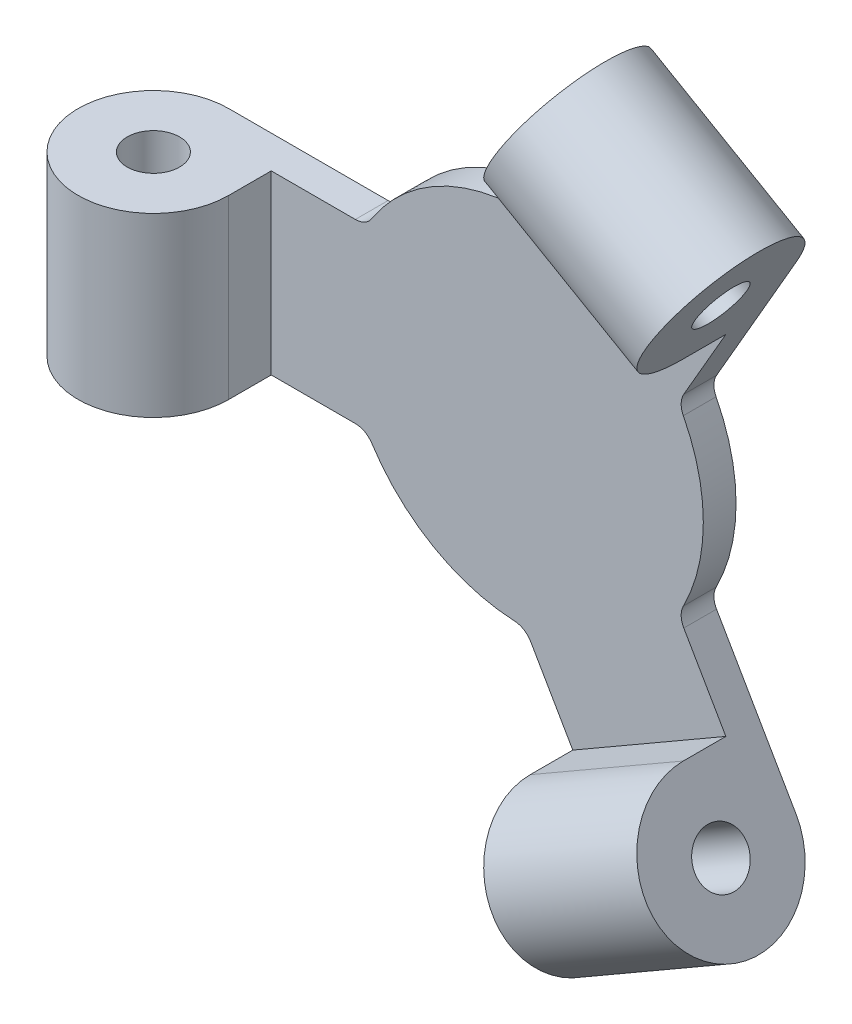
ISO-10303-21;
HEADER;
FILE_DESCRIPTION(('STEP AP214'),'2;1');
FILE_NAME('part.step','',(''),(''),'','','');
FILE_SCHEMA(('AUTOMOTIVE_DESIGN { 1 0 10303 214 1 1 1 1 }'));
ENDSEC;
DATA;
#1=APPLICATION_CONTEXT('core data for automotive mechanical design processes');
#2=APPLICATION_PROTOCOL_DEFINITION('international standard','automotive_design',2000,#1);
#3=PRODUCT_CONTEXT('',#1,'mechanical');
#4=PRODUCT('Part','Part','',(#3));
#5=PRODUCT_RELATED_PRODUCT_CATEGORY('part','',(#4));
#6=PRODUCT_DEFINITION_FORMATION('','',#4);
#7=PRODUCT_DEFINITION_CONTEXT('part definition',#1,'design');
#8=PRODUCT_DEFINITION('design','',#6,#7);
#9=PRODUCT_DEFINITION_SHAPE('','',#8);
#10=(LENGTH_UNIT() NAMED_UNIT(*) SI_UNIT(.MILLI.,.METRE.));
#11=(NAMED_UNIT(*) PLANE_ANGLE_UNIT() SI_UNIT($,.RADIAN.));
#12=(NAMED_UNIT(*) SI_UNIT($,.STERADIAN.) SOLID_ANGLE_UNIT());
#13=UNCERTAINTY_MEASURE_WITH_UNIT(LENGTH_MEASURE(1.E-05),#10,'distance_accuracy_value','');
#14=(GEOMETRIC_REPRESENTATION_CONTEXT(3) GLOBAL_UNCERTAINTY_ASSIGNED_CONTEXT((#13)) GLOBAL_UNIT_ASSIGNED_CONTEXT((#10,
#11,#12)) REPRESENTATION_CONTEXT('',''));
#15=CARTESIAN_POINT('',(0.,0.,0.));
#16=DIRECTION('',(0.,0.,1.));
#17=DIRECTION('',(1.,0.,0.));
#18=AXIS2_PLACEMENT_3D('',#15,#16,#17);
#19=CARTESIAN_POINT('',(7.55865704891,40.0919780457,11.5));
#20=DIRECTION('',(-0.500000000000017,-0.866025403784429,0.));
#21=DIRECTION('',(0.866025403784429,-0.500000000000017,0.));
#22=AXIS2_PLACEMENT_3D('',#19,#20,#21);
#23=PLANE('',#22);
#24=DIRECTION('',(0.,0.,1.));
#25=VECTOR('',#24,1.);
#26=CARTESIAN_POINT('',(7.55865704891,40.0919780457,0.));
#27=LINE('',#26,#25);
#28=CARTESIAN_POINT('',(7.55865704891,40.0919780457,5.));
#29=VERTEX_POINT('',#28);
#30=CARTESIAN_POINT('',(7.55865704891004,40.0919780456995,11.5));
#31=VERTEX_POINT('',#30);
#32=EDGE_CURVE('E203',#29,#31,#27,.T.);
#33=ORIENTED_EDGE('',*,*,#32,.F.);
#34=DIRECTION('',(-0.86602540378444,0.499999999999998,0.));
#35=VECTOR('',#34,1.);
#36=CARTESIAN_POINT('',(30.94134295109,26.5919780457,5.));
#37=LINE('',#36,#35);
#38=CARTESIAN_POINT('',(30.9413429510884,26.5919780457009,5.));
#39=VERTEX_POINT('',#38);
#40=EDGE_CURVE('E208',#39,#29,#37,.T.);
#41=ORIENTED_EDGE('',*,*,#40,.F.);
#42=DIRECTION('',(0.,0.,1.));
#43=VECTOR('',#42,1.);
#44=CARTESIAN_POINT('',(30.9413429510876,26.5919780457014,0.));
#45=LINE('',#44,#43);
#46=CARTESIAN_POINT('',(30.9413429510883,26.5919780456997,11.5));
#47=VERTEX_POINT('',#46);
#48=EDGE_CURVE('E153',#47,#39,#45,.F.);
#49=ORIENTED_EDGE('',*,*,#48,.F.);
#50=DIRECTION('',(0.866025403784429,-0.500000000000017,0.));
#51=VECTOR('',#50,1.);
#52=CARTESIAN_POINT('',(7.55865704890981,40.0919780456991,11.5));
#53=LINE('',#52,#51);
#54=EDGE_CURVE('E145',#31,#47,#53,.T.);
#55=ORIENTED_EDGE('',*,*,#54,.F.);
#56=EDGE_LOOP('',(#33,#41,#49,#55));
#57=FACE_BOUND('',#56,.T.);
#58=ADVANCED_FACE('F16',(#57),#23,.T.);
#59=CARTESIAN_POINT('',(13.30865704891,50.05127018922,11.5));
#60=DIRECTION('',(0.866025403784429,-0.500000000000017,0.));
#61=DIRECTION('',(0.500000000000017,0.866025403784429,0.));
#62=AXIS2_PLACEMENT_3D('',#59,#60,#61);
#63=CYLINDRICAL_SURFACE('',#62,4.);
#64=CARTESIAN_POINT('',(36.6913429510887,36.5512701892201,11.5));
#65=DIRECTION('',(0.866025403784429,-0.500000000000017,0.));
#66=DIRECTION('',(0.500000000000017,0.866025403784429,0.));
#67=AXIS2_PLACEMENT_3D('',#64,#65,#66);
#68=CIRCLE('',#67,4.);
#69=CARTESIAN_POINT('',(38.6913429510887,40.0153718043578,11.5));
#70=VERTEX_POINT('',#69);
#71=EDGE_CURVE('E19',#70,#70,#68,.F.);
#72=ORIENTED_EDGE('',*,*,#71,.F.);
#73=EDGE_LOOP('',(#72));
#74=FACE_BOUND('',#73,.T.);
#75=CARTESIAN_POINT('',(13.308657048911,50.0512701892194,11.5));
#76=DIRECTION('',(0.866025403784429,-0.500000000000017,0.));
#77=DIRECTION('',(0.500000000000017,0.866025403784429,0.));
#78=AXIS2_PLACEMENT_3D('',#75,#76,#77);
#79=CIRCLE('',#78,4.);
#80=CARTESIAN_POINT('',(15.3086570489111,53.5153718043571,11.5));
#81=VERTEX_POINT('',#80);
#82=EDGE_CURVE('E292',#81,#81,#79,.T.);
#83=ORIENTED_EDGE('',*,*,#82,.F.);
#84=EDGE_LOOP('',(#83));
#85=FACE_BOUND('',#84,.T.);
#86=ADVANCED_FACE('F651',(#74,#85),#63,.F.);
#87=CARTESIAN_POINT('',(-38.5,-13.5,11.5));
#88=DIRECTION('',(1.,0.,0.));
#89=DIRECTION('',(0.,0.,-1.));
#90=AXIS2_PLACEMENT_3D('',#87,#88,#89);
#91=PLANE('',#90);
#92=DIRECTION('',(0.,0.,-1.));
#93=VECTOR('',#92,1.);
#94=CARTESIAN_POINT('',(-38.5,-13.5,0.));
#95=LINE('',#94,#93);
#96=CARTESIAN_POINT('',(-38.5,-13.5,5.));
#97=VERTEX_POINT('',#96);
#98=CARTESIAN_POINT('',(-38.5,-13.5,11.5));
#99=VERTEX_POINT('',#98);
#100=EDGE_CURVE('E181',#97,#99,#95,.F.);
#101=ORIENTED_EDGE('',*,*,#100,.F.);
#102=DIRECTION('',(0.,1.,0.));
#103=VECTOR('',#102,1.);
#104=CARTESIAN_POINT('',(-38.5,0.,5.));
#105=LINE('',#104,#103);
#106=CARTESIAN_POINT('',(-38.5,13.5,5.));
#107=VERTEX_POINT('',#106);
#108=EDGE_CURVE('E179',#107,#97,#105,.F.);
#109=ORIENTED_EDGE('',*,*,#108,.F.);
#110=DIRECTION('',(0.,0.,1.));
#111=VECTOR('',#110,1.);
#112=CARTESIAN_POINT('',(-38.5,13.5,0.));
#113=LINE('',#112,#111);
#114=CARTESIAN_POINT('',(-38.5,13.5,11.5));
#115=VERTEX_POINT('',#114);
#116=EDGE_CURVE('E166',#115,#107,#113,.F.);
#117=ORIENTED_EDGE('',*,*,#116,.F.);
#118=DIRECTION('',(0.,1.,0.));
#119=VECTOR('',#118,1.);
#120=CARTESIAN_POINT('',(-38.5,-13.5,11.5));
#121=LINE('',#120,#119);
#122=EDGE_CURVE('E193',#99,#115,#121,.T.);
#123=ORIENTED_EDGE('',*,*,#122,.F.);
#124=EDGE_LOOP('',(#101,#109,#117,#123));
#125=FACE_BOUND('',#124,.T.);
#126=ADVANCED_FACE('F180',(#125),#91,.T.);
#127=CARTESIAN_POINT('',(-50.,-13.5,11.5));
#128=DIRECTION('',(0.,1.,0.));
#129=DIRECTION('',(0.,0.,1.));
#130=AXIS2_PLACEMENT_3D('',#127,#128,#129);
#131=CYLINDRICAL_SURFACE('',#130,4.);
#132=CARTESIAN_POINT('',(-50.,13.5,11.5));
#133=DIRECTION('',(0.,1.,0.));
#134=DIRECTION('',(0.,0.,1.));
#135=AXIS2_PLACEMENT_3D('',#132,#133,#134);
#136=CIRCLE('',#135,4.);
#137=CARTESIAN_POINT('',(-50.,13.5,15.5));
#138=VERTEX_POINT('',#137);
#139=EDGE_CURVE('E190',#138,#138,#136,.F.);
#140=ORIENTED_EDGE('',*,*,#139,.F.);
#141=EDGE_LOOP('',(#140));
#142=FACE_BOUND('',#141,.T.);
#143=CARTESIAN_POINT('',(-50.,-13.5,11.5));
#144=DIRECTION('',(0.,1.,0.));
#145=DIRECTION('',(0.,0.,1.));
#146=AXIS2_PLACEMENT_3D('',#143,#144,#145);
#147=CIRCLE('',#146,4.);
#148=CARTESIAN_POINT('',(-50.,-13.5,15.5));
#149=VERTEX_POINT('',#148);
#150=EDGE_CURVE('E276',#149,#149,#147,.T.);
#151=ORIENTED_EDGE('',*,*,#150,.F.);
#152=EDGE_LOOP('',(#151));
#153=FACE_BOUND('',#152,.T.);
#154=ADVANCED_FACE('F446',(#142,#153),#131,.F.);
#155=CARTESIAN_POINT('',(30.94134295109,-26.5919780457,11.5));
#156=DIRECTION('',(-0.500000000000017,0.866025403784429,0.));
#157=DIRECTION('',(-0.866025403784429,-0.500000000000017,0.));
#158=AXIS2_PLACEMENT_3D('',#155,#156,#157);
#159=PLANE('',#158);
#160=DIRECTION('',(0.,0.,1.));
#161=VECTOR('',#160,1.);
#162=CARTESIAN_POINT('',(30.94134295109,-26.5919780457,0.));
#163=LINE('',#162,#161);
#164=CARTESIAN_POINT('',(30.94134295109,-26.5919780457,5.));
#165=VERTEX_POINT('',#164);
#166=CARTESIAN_POINT('',(30.94134295109,-26.5919780456995,11.5));
#167=VERTEX_POINT('',#166);
#168=EDGE_CURVE('E256',#165,#167,#163,.T.);
#169=ORIENTED_EDGE('',*,*,#168,.F.);
#170=DIRECTION('',(0.86602540378444,0.499999999999998,0.));
#171=VECTOR('',#170,1.);
#172=CARTESIAN_POINT('',(7.55865704891,-40.0919780457,5.));
#173=LINE('',#172,#171);
#174=CARTESIAN_POINT('',(7.55865704890891,-40.0919780457006,5.));
#175=VERTEX_POINT('',#174);
#176=EDGE_CURVE('E184',#175,#165,#173,.T.);
#177=ORIENTED_EDGE('',*,*,#176,.F.);
#178=DIRECTION('',(0.,0.,1.));
#179=VECTOR('',#178,1.);
#180=CARTESIAN_POINT('',(7.55865704890836,-40.0919780457009,0.));
#181=LINE('',#180,#179);
#182=CARTESIAN_POINT('',(7.55865704890914,-40.0919780457004,11.5));
#183=VERTEX_POINT('',#182);
#184=EDGE_CURVE('E328',#183,#175,#181,.F.);
#185=ORIENTED_EDGE('',*,*,#184,.F.);
#186=DIRECTION('',(-0.866025403784429,-0.500000000000017,0.));
#187=VECTOR('',#186,1.);
#188=CARTESIAN_POINT('',(30.9413429510898,-26.5919780456991,11.5));
#189=LINE('',#188,#187);
#190=EDGE_CURVE('E260',#167,#183,#189,.T.);
#191=ORIENTED_EDGE('',*,*,#190,.F.);
#192=EDGE_LOOP('',(#169,#177,#185,#191));
#193=FACE_BOUND('',#192,.T.);
#194=ADVANCED_FACE('F443',(#193),#159,.T.);
#195=CARTESIAN_POINT('',(36.69134295109,-36.55127018922,11.5));
#196=DIRECTION('',(-0.866025403784429,-0.500000000000017,0.));
#197=DIRECTION('',(0.500000000000017,-0.866025403784429,0.));
#198=AXIS2_PLACEMENT_3D('',#195,#196,#197);
#199=CYLINDRICAL_SURFACE('',#198,4.);
#200=CARTESIAN_POINT('',(13.3086570489092,-50.0512701892211,11.5));
#201=DIRECTION('',(-0.866025403784429,-0.500000000000017,0.));
#202=DIRECTION('',(0.500000000000017,-0.866025403784429,0.));
#203=AXIS2_PLACEMENT_3D('',#200,#201,#202);
#204=CIRCLE('',#203,4.);
#205=CARTESIAN_POINT('',(15.3086570489093,-53.5153718043588,11.5));
#206=VERTEX_POINT('',#205);
#207=EDGE_CURVE('E261',#206,#206,#204,.F.);
#208=ORIENTED_EDGE('',*,*,#207,.F.);
#209=EDGE_LOOP('',(#208));
#210=FACE_BOUND('',#209,.T.);
#211=CARTESIAN_POINT('',(36.691342951091,-36.5512701892194,11.5));
#212=DIRECTION('',(-0.866025403784429,-0.500000000000017,0.));
#213=DIRECTION('',(0.500000000000017,-0.866025403784429,0.));
#214=AXIS2_PLACEMENT_3D('',#211,#212,#213);
#215=CIRCLE('',#214,4.);
#216=CARTESIAN_POINT('',(38.6913429510911,-40.0153718043571,11.5));
#217=VERTEX_POINT('',#216);
#218=EDGE_CURVE('E251',#217,#217,#215,.T.);
#219=ORIENTED_EDGE('',*,*,#218,.F.);
#220=EDGE_LOOP('',(#219));
#221=FACE_BOUND('',#220,.T.);
#222=ADVANCED_FACE('F445',(#210,#221),#199,.F.);
#223=CARTESIAN_POINT('',(0.,0.,5.));
#224=DIRECTION('',(0.,0.,1.));
#225=DIRECTION('',(1.,0.,0.));
#226=AXIS2_PLACEMENT_3D('',#223,#224,#225);
#227=PLANE('',#226);
#228=DIRECTION('',(0.500000000000017,0.866025403784429,0.));
#229=VECTOR('',#228,1.);
#230=CARTESIAN_POINT('',(23.6704915018,13.99849392125,5.));
#231=LINE('',#230,#229);
#232=CARTESIAN_POINT('',(24.5170982894668,15.4648598915209,5.));
#233=VERTEX_POINT('',#232);
#234=EDGE_CURVE('E356',#39,#233,#231,.F.);
#235=ORIENTED_EDGE('',*,*,#234,.F.);
#236=ORIENTED_EDGE('',*,*,#40,.T.);
#237=DIRECTION('',(-0.500000000000017,-0.866025403784429,0.));
#238=VECTOR('',#237,1.);
#239=CARTESIAN_POINT('',(7.55865704891,40.0919780457,5.));
#240=LINE('',#239,#238);
#241=CARTESIAN_POINT('',(1.13441238728994,28.9648598915204,5.));
#242=VERTEX_POINT('',#241);
#243=EDGE_CURVE('E200',#242,#29,#240,.F.);
#244=ORIENTED_EDGE('',*,*,#243,.F.);
#245=CARTESIAN_POINT('',(-1.463663824063,30.46485989152,5.));
#246=DIRECTION('',(0.,0.,1.));
#247=DIRECTION('',(1.,0.,0.));
#248=AXIS2_PLACEMENT_3D('',#245,#246,#247);
#249=CIRCLE('',#248,3.);
#250=CARTESIAN_POINT('',(-1.31969689054826,27.4683162956355,5.));
#251=VERTEX_POINT('',#250);
#252=EDGE_CURVE('E288',#242,#251,#249,.F.);
#253=ORIENTED_EDGE('',*,*,#252,.T.);
#254=CARTESIAN_POINT('',(0.,0.,5.));
#255=DIRECTION('',(0.,0.,1.));
#256=DIRECTION('',(1.,0.,0.));
#257=AXIS2_PLACEMENT_3D('',#254,#255,#256);
#258=CIRCLE('',#257,27.5);
#259=CARTESIAN_POINT('',(-23.1284112659309,14.8770491803291,5.));
#260=VERTEX_POINT('',#259);
#261=EDGE_CURVE('E285',#260,#251,#258,.F.);
#262=ORIENTED_EDGE('',*,*,#261,.F.);
#263=CARTESIAN_POINT('',(-25.65151067676,16.5,5.));
#264=DIRECTION('',(0.,0.,1.));
#265=DIRECTION('',(1.,0.,0.));
#266=AXIS2_PLACEMENT_3D('',#263,#264,#265);
#267=CIRCLE('',#266,3.);
#268=CARTESIAN_POINT('',(-25.65151067676,13.5,5.));
#269=VERTEX_POINT('',#268);
#270=EDGE_CURVE('E189',#260,#269,#267,.F.);
#271=ORIENTED_EDGE('',*,*,#270,.T.);
#272=DIRECTION('',(1.,0.,0.));
#273=VECTOR('',#272,1.);
#274=CARTESIAN_POINT('',(-23.95829710142,13.5,5.));
#275=LINE('',#274,#273);
#276=EDGE_CURVE('E170',#107,#269,#275,.T.);
#277=ORIENTED_EDGE('',*,*,#276,.F.);
#278=ORIENTED_EDGE('',*,*,#108,.T.);
#279=DIRECTION('',(1.,0.,0.));
#280=VECTOR('',#279,1.);
#281=CARTESIAN_POINT('',(-38.5,-13.5,5.));
#282=LINE('',#281,#280);
#283=CARTESIAN_POINT('',(-25.65151067676,-13.5,5.));
#284=VERTEX_POINT('',#283);
#285=EDGE_CURVE('E281',#284,#97,#282,.F.);
#286=ORIENTED_EDGE('',*,*,#285,.F.);
#287=CARTESIAN_POINT('',(-25.65151067676,-16.5,5.));
#288=DIRECTION('',(0.,0.,1.));
#289=DIRECTION('',(1.,0.,0.));
#290=AXIS2_PLACEMENT_3D('',#287,#288,#289);
#291=CIRCLE('',#290,3.);
#292=CARTESIAN_POINT('',(-23.1284112659313,-14.8770491803294,5.));
#293=VERTEX_POINT('',#292);
#294=EDGE_CURVE('E272',#284,#293,#291,.F.);
#295=ORIENTED_EDGE('',*,*,#294,.T.);
#296=CARTESIAN_POINT('',(0.,0.,5.));
#297=DIRECTION('',(0.,0.,1.));
#298=DIRECTION('',(1.,0.,0.));
#299=AXIS2_PLACEMENT_3D('',#296,#297,#298);
#300=CIRCLE('',#299,27.5);
#301=CARTESIAN_POINT('',(-1.31969689054819,-27.468316295634,5.));
#302=VERTEX_POINT('',#301);
#303=EDGE_CURVE('E269',#302,#293,#300,.F.);
#304=ORIENTED_EDGE('',*,*,#303,.F.);
#305=CARTESIAN_POINT('',(-1.463663824063,-30.46485989152,5.));
#306=DIRECTION('',(0.,0.,1.));
#307=DIRECTION('',(1.,0.,0.));
#308=AXIS2_PLACEMENT_3D('',#305,#306,#307);
#309=CIRCLE('',#308,3.);
#310=CARTESIAN_POINT('',(1.13441238728785,-28.9648598915216,5.));
#311=VERTEX_POINT('',#310);
#312=EDGE_CURVE('E265',#302,#311,#309,.F.);
#313=ORIENTED_EDGE('',*,*,#312,.T.);
#314=DIRECTION('',(0.500000000000017,-0.866025403784429,0.));
#315=VECTOR('',#314,1.);
#316=CARTESIAN_POINT('',(0.287805599621,-27.49849392125,5.));
#317=LINE('',#316,#315);
#318=EDGE_CURVE('E264',#175,#311,#317,.F.);
#319=ORIENTED_EDGE('',*,*,#318,.F.);
#320=ORIENTED_EDGE('',*,*,#176,.T.);
#321=DIRECTION('',(-0.500000000000017,0.866025403784429,0.));
#322=VECTOR('',#321,1.);
#323=CARTESIAN_POINT('',(30.94134295109,-26.5919780457,5.));
#324=LINE('',#323,#322);
#325=CARTESIAN_POINT('',(24.517098289468,-15.4648598915202,5.));
#326=VERTEX_POINT('',#325);
#327=EDGE_CURVE('E259',#326,#165,#324,.F.);
#328=ORIENTED_EDGE('',*,*,#327,.F.);
#329=CARTESIAN_POINT('',(27.11517450082,-13.96485989152,5.));
#330=DIRECTION('',(0.,0.,1.));
#331=DIRECTION('',(1.,0.,0.));
#332=AXIS2_PLACEMENT_3D('',#329,#330,#331);
#333=CIRCLE('',#332,3.);
#334=CARTESIAN_POINT('',(24.4481081564802,-12.5912671153083,5.));
#335=VERTEX_POINT('',#334);
#336=EDGE_CURVE('E247',#326,#335,#333,.F.);
#337=ORIENTED_EDGE('',*,*,#336,.T.);
#338=CARTESIAN_POINT('',(0.,0.,5.));
#339=DIRECTION('',(0.,0.,1.));
#340=DIRECTION('',(1.,0.,0.));
#341=AXIS2_PLACEMENT_3D('',#338,#339,#340);
#342=CIRCLE('',#341,27.5);
#343=CARTESIAN_POINT('',(24.4481081564781,12.5912671153072,5.));
#344=VERTEX_POINT('',#343);
#345=EDGE_CURVE('E244',#344,#335,#342,.F.);
#346=ORIENTED_EDGE('',*,*,#345,.F.);
#347=CARTESIAN_POINT('',(27.11517450082,13.96485989152,5.));
#348=DIRECTION('',(0.,0.,1.));
#349=DIRECTION('',(1.,0.,0.));
#350=AXIS2_PLACEMENT_3D('',#347,#348,#349);
#351=CIRCLE('',#350,3.);
#352=EDGE_CURVE('E240',#344,#233,#351,.F.);
#353=ORIENTED_EDGE('',*,*,#352,.T.);
#354=EDGE_LOOP('',(#235,#236,#244,#253,#262,#271,#277,#278,#286,#295,#304,#313,#319,#320,#328,
#337,#346,#353));
#355=FACE_BOUND('',#354,.T.);
#356=ADVANCED_FACE('F187',(#355),#227,.T.);
#357=CARTESIAN_POINT('',(23.6704915018,13.99849392125,0.));
#358=DIRECTION('',(0.866025403784429,-0.500000000000017,0.));
#359=DIRECTION('',(0.500000000000017,0.866025403784429,0.));
#360=AXIS2_PLACEMENT_3D('',#357,#358,#359);
#361=PLANE('',#360);
#362=ORIENTED_EDGE('',*,*,#71,.T.);
#363=EDGE_LOOP('',(#362));
#364=FACE_BOUND('',#363,.T.);
#365=ORIENTED_EDGE('',*,*,#48,.T.);
#366=ORIENTED_EDGE('',*,*,#234,.T.);
#367=DIRECTION('',(0.,0.,1.));
#368=VECTOR('',#367,1.);
#369=CARTESIAN_POINT('',(24.5170982894675,15.4648598915214,-6.518));
#370=LINE('',#369,#368);
#371=CARTESIAN_POINT('',(24.5170982894683,15.46485989152,0.));
#372=VERTEX_POINT('',#371);
#373=EDGE_CURVE('E312',#233,#372,#370,.F.);
#374=ORIENTED_EDGE('',*,*,#373,.T.);
#375=DIRECTION('',(0.5,0.866025403784438,0.));
#376=VECTOR('',#375,1.);
#377=CARTESIAN_POINT('',(24.51709828947,15.46485989152,0.));
#378=LINE('',#377,#376);
#379=CARTESIAN_POINT('',(36.6913429510897,36.5512701892198,0.));
#380=VERTEX_POINT('',#379);
#381=EDGE_CURVE('E243',#372,#380,#378,.T.);
#382=ORIENTED_EDGE('',*,*,#381,.T.);
#383=CARTESIAN_POINT('',(36.6913429510895,36.5512701892196,11.5));
#384=DIRECTION('',(0.866025403784429,-0.500000000000017,0.));
#385=DIRECTION('',(0.500000000000017,0.866025403784429,0.));
#386=AXIS2_PLACEMENT_3D('',#383,#384,#385);
#387=CIRCLE('',#386,11.5);
#388=EDGE_CURVE('E204',#47,#380,#387,.F.);
#389=ORIENTED_EDGE('',*,*,#388,.F.);
#390=EDGE_LOOP('',(#365,#366,#374,#382,#389));
#391=FACE_BOUND('',#390,.T.);
#392=ADVANCED_FACE('F310',(#364,#391),#361,.T.);
#393=CARTESIAN_POINT('',(13.30865704891,50.05127018922,11.5));
#394=DIRECTION('',(0.866025403784429,-0.500000000000017,0.));
#395=DIRECTION('',(0.500000000000017,0.866025403784429,0.));
#396=AXIS2_PLACEMENT_3D('',#393,#394,#395);
#397=CYLINDRICAL_SURFACE('',#396,11.5);
#398=DIRECTION('',(-0.86602540378444,0.499999999999998,0.));
#399=VECTOR('',#398,1.);
#400=CARTESIAN_POINT('',(36.69134295109,36.55127018922,0.));
#401=LINE('',#400,#399);
#402=CARTESIAN_POINT('',(13.30865704891,50.05127018922,0.));
#403=VERTEX_POINT('',#402);
#404=EDGE_CURVE('E299',#380,#403,#401,.T.);
#405=ORIENTED_EDGE('',*,*,#404,.T.);
#406=CARTESIAN_POINT('',(13.30865704891,50.05127018922,11.5));
#407=DIRECTION('',(0.866025403784429,-0.500000000000017,0.));
#408=DIRECTION('',(0.500000000000017,0.866025403784429,0.));
#409=AXIS2_PLACEMENT_3D('',#406,#407,#408);
#410=CIRCLE('',#409,11.5);
#411=EDGE_CURVE('E295',#31,#403,#410,.F.);
#412=ORIENTED_EDGE('',*,*,#411,.F.);
#413=ORIENTED_EDGE('',*,*,#54,.T.);
#414=ORIENTED_EDGE('',*,*,#388,.T.);
#415=EDGE_LOOP('',(#405,#412,#413,#414));
#416=FACE_BOUND('',#415,.T.);
#417=ADVANCED_FACE('F298',(#416),#397,.T.);
#418=CARTESIAN_POINT('',(7.55865704891,40.0919780457,0.));
#419=DIRECTION('',(-0.866025403784429,0.500000000000017,0.));
#420=DIRECTION('',(-0.500000000000017,-0.866025403784429,0.));
#421=AXIS2_PLACEMENT_3D('',#418,#419,#420);
#422=PLANE('',#421);
#423=ORIENTED_EDGE('',*,*,#82,.T.);
#424=EDGE_LOOP('',(#423));
#425=FACE_BOUND('',#424,.T.);
#426=ORIENTED_EDGE('',*,*,#411,.T.);
#427=DIRECTION('',(-0.499999999999969,-0.866025403784456,0.));
#428=VECTOR('',#427,1.);
#429=CARTESIAN_POINT('',(13.30865704891,50.05127018922,0.));
#430=LINE('',#429,#428);
#431=CARTESIAN_POINT('',(1.13441238729068,28.96485989152,0.));
#432=VERTEX_POINT('',#431);
#433=EDGE_CURVE('E239',#403,#432,#430,.T.);
#434=ORIENTED_EDGE('',*,*,#433,.T.);
#435=DIRECTION('',(0.,0.,1.));
#436=VECTOR('',#435,1.);
#437=CARTESIAN_POINT('',(1.13441238729049,28.9648598915203,-6.518));
#438=LINE('',#437,#436);
#439=EDGE_CURVE('E291',#432,#242,#438,.T.);
#440=ORIENTED_EDGE('',*,*,#439,.T.);
#441=ORIENTED_EDGE('',*,*,#243,.T.);
#442=ORIENTED_EDGE('',*,*,#32,.T.);
#443=EDGE_LOOP('',(#426,#434,#440,#441,#442));
#444=FACE_BOUND('',#443,.T.);
#445=ADVANCED_FACE('F402',(#425,#444),#422,.T.);
#446=CARTESIAN_POINT('',(-1.463663824063,30.46485989152,-6.518));
#447=DIRECTION('',(0.,0.,1.));
#448=DIRECTION('',(1.,0.,0.));
#449=AXIS2_PLACEMENT_3D('',#446,#447,#448);
#450=CYLINDRICAL_SURFACE('',#449,3.);
#451=ORIENTED_EDGE('',*,*,#439,.F.);
#452=CARTESIAN_POINT('',(-1.463663824063,30.46485989152,0.));
#453=DIRECTION('',(0.,0.,1.));
#454=DIRECTION('',(1.,0.,0.));
#455=AXIS2_PLACEMENT_3D('',#452,#453,#454);
#456=CIRCLE('',#455,3.);
#457=CARTESIAN_POINT('',(-1.31969689054826,27.4683162956355,0.));
#458=VERTEX_POINT('',#457);
#459=EDGE_CURVE('E236',#432,#458,#456,.F.);
#460=ORIENTED_EDGE('',*,*,#459,.T.);
#461=DIRECTION('',(0.,0.,1.));
#462=VECTOR('',#461,1.);
#463=CARTESIAN_POINT('',(-1.31969689054779,27.4683162956356,0.));
#464=LINE('',#463,#462);
#465=EDGE_CURVE('E287',#251,#458,#464,.F.);
#466=ORIENTED_EDGE('',*,*,#465,.F.);
#467=ORIENTED_EDGE('',*,*,#252,.F.);
#468=EDGE_LOOP('',(#451,#460,#466,#467));
#469=FACE_BOUND('',#468,.T.);
#470=ADVANCED_FACE('F399',(#469),#450,.F.);
#471=CARTESIAN_POINT('',(0.,0.,0.));
#472=DIRECTION('',(0.,0.,1.));
#473=DIRECTION('',(1.,0.,0.));
#474=AXIS2_PLACEMENT_3D('',#471,#472,#473);
#475=CYLINDRICAL_SURFACE('',#474,27.5);
#476=CARTESIAN_POINT('',(0.,0.,0.));
#477=DIRECTION('',(0.,0.,1.));
#478=DIRECTION('',(1.,0.,0.));
#479=AXIS2_PLACEMENT_3D('',#476,#477,#478);
#480=CIRCLE('',#479,27.5);
#481=CARTESIAN_POINT('',(-23.1284112659304,14.8770491803288,0.));
#482=VERTEX_POINT('',#481);
#483=EDGE_CURVE('E233',#458,#482,#480,.T.);
#484=ORIENTED_EDGE('',*,*,#483,.T.);
#485=DIRECTION('',(0.,0.,1.));
#486=VECTOR('',#485,1.);
#487=CARTESIAN_POINT('',(-23.1284112659298,14.8770491803298,-6.518));
#488=LINE('',#487,#486);
#489=EDGE_CURVE('E284',#482,#260,#488,.T.);
#490=ORIENTED_EDGE('',*,*,#489,.T.);
#491=ORIENTED_EDGE('',*,*,#261,.T.);
#492=ORIENTED_EDGE('',*,*,#465,.T.);
#493=EDGE_LOOP('',(#484,#490,#491,#492));
#494=FACE_BOUND('',#493,.T.);
#495=ADVANCED_FACE('F396',(#494),#475,.T.);
#496=CARTESIAN_POINT('',(-25.65151067676,16.5,-6.518));
#497=DIRECTION('',(0.,0.,1.));
#498=DIRECTION('',(1.,0.,0.));
#499=AXIS2_PLACEMENT_3D('',#496,#497,#498);
#500=CYLINDRICAL_SURFACE('',#499,3.);
#501=ORIENTED_EDGE('',*,*,#489,.F.);
#502=CARTESIAN_POINT('',(-25.65151067676,16.5,0.));
#503=DIRECTION('',(0.,0.,1.));
#504=DIRECTION('',(1.,0.,0.));
#505=AXIS2_PLACEMENT_3D('',#502,#503,#504);
#506=CIRCLE('',#505,3.);
#507=CARTESIAN_POINT('',(-25.65151067676,13.5,0.));
#508=VERTEX_POINT('',#507);
#509=EDGE_CURVE('E229',#482,#508,#506,.F.);
#510=ORIENTED_EDGE('',*,*,#509,.T.);
#511=DIRECTION('',(0.,0.,1.));
#512=VECTOR('',#511,1.);
#513=CARTESIAN_POINT('',(-25.65151067676,13.5,0.));
#514=LINE('',#513,#512);
#515=EDGE_CURVE('E176',#269,#508,#514,.F.);
#516=ORIENTED_EDGE('',*,*,#515,.F.);
#517=ORIENTED_EDGE('',*,*,#270,.F.);
#518=EDGE_LOOP('',(#501,#510,#516,#517));
#519=FACE_BOUND('',#518,.T.);
#520=ADVANCED_FACE('F394',(#519),#500,.F.);
#521=CARTESIAN_POINT('',(-23.95829710142,13.5,0.));
#522=DIRECTION('',(0.,1.,0.));
#523=DIRECTION('',(0.,0.,1.));
#524=AXIS2_PLACEMENT_3D('',#521,#522,#523);
#525=PLANE('',#524);
#526=ORIENTED_EDGE('',*,*,#139,.T.);
#527=EDGE_LOOP('',(#526));
#528=FACE_BOUND('',#527,.T.);
#529=ORIENTED_EDGE('',*,*,#116,.T.);
#530=ORIENTED_EDGE('',*,*,#276,.T.);
#531=ORIENTED_EDGE('',*,*,#515,.T.);
#532=DIRECTION('',(1.,0.,0.));
#533=VECTOR('',#532,1.);
#534=CARTESIAN_POINT('',(0.,13.5,0.));
#535=LINE('',#534,#533);
#536=CARTESIAN_POINT('',(-50.,13.5,0.));
#537=VERTEX_POINT('',#536);
#538=EDGE_CURVE('E232',#508,#537,#535,.F.);
#539=ORIENTED_EDGE('',*,*,#538,.T.);
#540=CARTESIAN_POINT('',(-50.,13.5,11.5));
#541=DIRECTION('',(0.,1.,0.));
#542=DIRECTION('',(0.,0.,1.));
#543=AXIS2_PLACEMENT_3D('',#540,#541,#542);
#544=CIRCLE('',#543,11.5);
#545=EDGE_CURVE('E173',#115,#537,#544,.F.);
#546=ORIENTED_EDGE('',*,*,#545,.F.);
#547=EDGE_LOOP('',(#529,#530,#531,#539,#546));
#548=FACE_BOUND('',#547,.T.);
#549=ADVANCED_FACE('F168',(#528,#548),#525,.T.);
#550=CARTESIAN_POINT('',(-50.,-13.5,11.5));
#551=DIRECTION('',(0.,1.,0.));
#552=DIRECTION('',(0.,0.,1.));
#553=AXIS2_PLACEMENT_3D('',#550,#551,#552);
#554=CYLINDRICAL_SURFACE('',#553,11.5);
#555=DIRECTION('',(0.,1.,0.));
#556=VECTOR('',#555,1.);
#557=CARTESIAN_POINT('',(-50.,0.,0.));
#558=LINE('',#557,#556);
#559=CARTESIAN_POINT('',(-50.,-13.5,0.));
#560=VERTEX_POINT('',#559);
#561=EDGE_CURVE('E341',#537,#560,#558,.F.);
#562=ORIENTED_EDGE('',*,*,#561,.T.);
#563=CARTESIAN_POINT('',(-50.,-13.5,11.5));
#564=DIRECTION('',(0.,1.,0.));
#565=DIRECTION('',(0.,0.,1.));
#566=AXIS2_PLACEMENT_3D('',#563,#564,#565);
#567=CIRCLE('',#566,11.5);
#568=EDGE_CURVE('E279',#99,#560,#567,.F.);
#569=ORIENTED_EDGE('',*,*,#568,.F.);
#570=ORIENTED_EDGE('',*,*,#122,.T.);
#571=ORIENTED_EDGE('',*,*,#545,.T.);
#572=EDGE_LOOP('',(#562,#569,#570,#571));
#573=FACE_BOUND('',#572,.T.);
#574=ADVANCED_FACE('F379',(#573),#554,.T.);
#575=CARTESIAN_POINT('',(-38.5,-13.5,0.));
#576=DIRECTION('',(0.,-1.,0.));
#577=DIRECTION('',(0.,0.,-1.));
#578=AXIS2_PLACEMENT_3D('',#575,#576,#577);
#579=PLANE('',#578);
#580=ORIENTED_EDGE('',*,*,#150,.T.);
#581=EDGE_LOOP('',(#580));
#582=FACE_BOUND('',#581,.T.);
#583=ORIENTED_EDGE('',*,*,#568,.T.);
#584=DIRECTION('',(1.,0.,0.));
#585=VECTOR('',#584,1.);
#586=CARTESIAN_POINT('',(0.,-13.5,0.));
#587=LINE('',#586,#585);
#588=CARTESIAN_POINT('',(-25.65151067676,-13.5,0.));
#589=VERTEX_POINT('',#588);
#590=EDGE_CURVE('E228',#560,#589,#587,.T.);
#591=ORIENTED_EDGE('',*,*,#590,.T.);
#592=DIRECTION('',(0.,0.,1.));
#593=VECTOR('',#592,1.);
#594=CARTESIAN_POINT('',(-25.65151067676,-13.5,-6.518));
#595=LINE('',#594,#593);
#596=EDGE_CURVE('E275',#589,#284,#595,.T.);
#597=ORIENTED_EDGE('',*,*,#596,.T.);
#598=ORIENTED_EDGE('',*,*,#285,.T.);
#599=ORIENTED_EDGE('',*,*,#100,.T.);
#600=EDGE_LOOP('',(#583,#591,#597,#598,#599));
#601=FACE_BOUND('',#600,.T.);
#602=ADVANCED_FACE('F384',(#582,#601),#579,.T.);
#603=CARTESIAN_POINT('',(-25.65151067676,-16.5,-6.518));
#604=DIRECTION('',(0.,0.,1.));
#605=DIRECTION('',(1.,0.,0.));
#606=AXIS2_PLACEMENT_3D('',#603,#604,#605);
#607=CYLINDRICAL_SURFACE('',#606,3.);
#608=ORIENTED_EDGE('',*,*,#596,.F.);
#609=CARTESIAN_POINT('',(-25.65151067676,-16.5,0.));
#610=DIRECTION('',(0.,0.,1.));
#611=DIRECTION('',(1.,0.,0.));
#612=AXIS2_PLACEMENT_3D('',#609,#610,#611);
#613=CIRCLE('',#612,3.);
#614=CARTESIAN_POINT('',(-23.1284112659313,-14.8770491803294,0.));
#615=VERTEX_POINT('',#614);
#616=EDGE_CURVE('E225',#589,#615,#613,.F.);
#617=ORIENTED_EDGE('',*,*,#616,.T.);
#618=DIRECTION('',(0.,0.,1.));
#619=VECTOR('',#618,1.);
#620=CARTESIAN_POINT('',(-23.1284112659307,-14.8770491803304,0.));
#621=LINE('',#620,#619);
#622=EDGE_CURVE('E271',#293,#615,#621,.F.);
#623=ORIENTED_EDGE('',*,*,#622,.F.);
#624=ORIENTED_EDGE('',*,*,#294,.F.);
#625=EDGE_LOOP('',(#608,#617,#623,#624));
#626=FACE_BOUND('',#625,.T.);
#627=ADVANCED_FACE('F440',(#626),#607,.F.);
#628=CARTESIAN_POINT('',(0.,0.,0.));
#629=DIRECTION('',(0.,0.,1.));
#630=DIRECTION('',(1.,0.,0.));
#631=AXIS2_PLACEMENT_3D('',#628,#629,#630);
#632=CYLINDRICAL_SURFACE('',#631,27.5);
#633=ORIENTED_EDGE('',*,*,#303,.T.);
#634=ORIENTED_EDGE('',*,*,#622,.T.);
#635=CARTESIAN_POINT('',(0.,0.,0.));
#636=DIRECTION('',(0.,0.,1.));
#637=DIRECTION('',(1.,0.,0.));
#638=AXIS2_PLACEMENT_3D('',#635,#636,#637);
#639=CIRCLE('',#638,27.5);
#640=CARTESIAN_POINT('',(-1.31969689054812,-27.4683162956325,0.));
#641=VERTEX_POINT('',#640);
#642=EDGE_CURVE('E222',#615,#641,#639,.T.);
#643=ORIENTED_EDGE('',*,*,#642,.T.);
#644=DIRECTION('',(0.,0.,1.));
#645=VECTOR('',#644,1.);
#646=CARTESIAN_POINT('',(-1.31969689054764,-27.4683162956325,-6.518));
#647=LINE('',#646,#645);
#648=EDGE_CURVE('E268',#641,#302,#647,.T.);
#649=ORIENTED_EDGE('',*,*,#648,.T.);
#650=EDGE_LOOP('',(#633,#634,#643,#649));
#651=FACE_BOUND('',#650,.T.);
#652=ADVANCED_FACE('F436',(#651),#632,.T.);
#653=CARTESIAN_POINT('',(-1.463663824063,-30.46485989152,-6.518));
#654=DIRECTION('',(0.,0.,1.));
#655=DIRECTION('',(1.,0.,0.));
#656=AXIS2_PLACEMENT_3D('',#653,#654,#655);
#657=CYLINDRICAL_SURFACE('',#656,3.);
#658=ORIENTED_EDGE('',*,*,#648,.F.);
#659=CARTESIAN_POINT('',(-1.463663824063,-30.46485989152,0.));
#660=DIRECTION('',(0.,0.,1.));
#661=DIRECTION('',(1.,0.,0.));
#662=AXIS2_PLACEMENT_3D('',#659,#660,#661);
#663=CIRCLE('',#662,3.);
#664=CARTESIAN_POINT('',(1.13441238728941,-28.9648598915208,0.));
#665=VERTEX_POINT('',#664);
#666=EDGE_CURVE('E218',#641,#665,#663,.F.);
#667=ORIENTED_EDGE('',*,*,#666,.T.);
#668=DIRECTION('',(0.,0.,1.));
#669=VECTOR('',#668,1.);
#670=CARTESIAN_POINT('',(1.13441238728795,-28.9648598915218,0.));
#671=LINE('',#670,#669);
#672=EDGE_CURVE('E267',#311,#665,#671,.F.);
#673=ORIENTED_EDGE('',*,*,#672,.F.);
#674=ORIENTED_EDGE('',*,*,#312,.F.);
#675=EDGE_LOOP('',(#658,#667,#673,#674));
#676=FACE_BOUND('',#675,.T.);
#677=ADVANCED_FACE('F434',(#676),#657,.F.);
#678=CARTESIAN_POINT('',(0.287805599621,-27.49849392125,0.));
#679=DIRECTION('',(-0.866025403784429,-0.500000000000017,0.));
#680=DIRECTION('',(0.500000000000017,-0.866025403784429,0.));
#681=AXIS2_PLACEMENT_3D('',#678,#679,#680);
#682=PLANE('',#681);
#683=ORIENTED_EDGE('',*,*,#207,.T.);
#684=EDGE_LOOP('',(#683));
#685=FACE_BOUND('',#684,.T.);
#686=ORIENTED_EDGE('',*,*,#184,.T.);
#687=ORIENTED_EDGE('',*,*,#318,.T.);
#688=ORIENTED_EDGE('',*,*,#672,.T.);
#689=DIRECTION('',(0.499999999999969,-0.866025403784456,0.));
#690=VECTOR('',#689,1.);
#691=CARTESIAN_POINT('',(1.134412387291,-28.96485989152,0.));
#692=LINE('',#691,#690);
#693=CARTESIAN_POINT('',(13.30865704891,-50.0512701892203,0.));
#694=VERTEX_POINT('',#693);
#695=EDGE_CURVE('E221',#665,#694,#692,.T.);
#696=ORIENTED_EDGE('',*,*,#695,.T.);
#697=CARTESIAN_POINT('',(13.30865704891,-50.0512701892207,11.5));
#698=DIRECTION('',(-0.866025403784429,-0.500000000000017,0.));
#699=DIRECTION('',(0.500000000000017,-0.866025403784429,0.));
#700=AXIS2_PLACEMENT_3D('',#697,#698,#699);
#701=CIRCLE('',#700,11.5);
#702=EDGE_CURVE('E257',#183,#694,#701,.F.);
#703=ORIENTED_EDGE('',*,*,#702,.F.);
#704=EDGE_LOOP('',(#686,#687,#688,#696,#703));
#705=FACE_BOUND('',#704,.T.);
#706=ADVANCED_FACE('F429',(#685,#705),#682,.T.);
#707=CARTESIAN_POINT('',(36.69134295109,-36.55127018922,11.5));
#708=DIRECTION('',(-0.866025403784429,-0.500000000000017,0.));
#709=DIRECTION('',(0.500000000000017,-0.866025403784429,0.));
#710=AXIS2_PLACEMENT_3D('',#707,#708,#709);
#711=CYLINDRICAL_SURFACE('',#710,11.5);
#712=DIRECTION('',(0.86602540378444,0.499999999999998,0.));
#713=VECTOR('',#712,1.);
#714=CARTESIAN_POINT('',(13.30865704891,-50.05127018922,0.));
#715=LINE('',#714,#713);
#716=CARTESIAN_POINT('',(36.69134295109,-36.55127018922,0.));
#717=VERTEX_POINT('',#716);
#718=EDGE_CURVE('E325',#694,#717,#715,.T.);
#719=ORIENTED_EDGE('',*,*,#718,.T.);
#720=CARTESIAN_POINT('',(36.69134295109,-36.55127018922,11.5));
#721=DIRECTION('',(-0.866025403784429,-0.500000000000017,0.));
#722=DIRECTION('',(0.500000000000017,-0.866025403784429,0.));
#723=AXIS2_PLACEMENT_3D('',#720,#721,#722);
#724=CIRCLE('',#723,11.5);
#725=EDGE_CURVE('E254',#167,#717,#724,.F.);
#726=ORIENTED_EDGE('',*,*,#725,.F.);
#727=ORIENTED_EDGE('',*,*,#190,.T.);
#728=ORIENTED_EDGE('',*,*,#702,.T.);
#729=EDGE_LOOP('',(#719,#726,#727,#728));
#730=FACE_BOUND('',#729,.T.);
#731=ADVANCED_FACE('F422',(#730),#711,.T.);
#732=CARTESIAN_POINT('',(30.94134295109,-26.5919780457,0.));
#733=DIRECTION('',(0.866025403784429,0.500000000000017,0.));
#734=DIRECTION('',(-0.500000000000017,0.866025403784429,0.));
#735=AXIS2_PLACEMENT_3D('',#732,#733,#734);
#736=PLANE('',#735);
#737=ORIENTED_EDGE('',*,*,#218,.T.);
#738=EDGE_LOOP('',(#737));
#739=FACE_BOUND('',#738,.T.);
#740=ORIENTED_EDGE('',*,*,#725,.T.);
#741=DIRECTION('',(-0.5,0.866025403784438,0.));
#742=VECTOR('',#741,1.);
#743=CARTESIAN_POINT('',(36.69134295109,-36.55127018922,0.));
#744=LINE('',#743,#742);
#745=CARTESIAN_POINT('',(24.5170982894683,-15.46485989152,0.));
#746=VERTEX_POINT('',#745);
#747=EDGE_CURVE('E217',#717,#746,#744,.T.);
#748=ORIENTED_EDGE('',*,*,#747,.T.);
#749=DIRECTION('',(0.,0.,1.));
#750=VECTOR('',#749,1.);
#751=CARTESIAN_POINT('',(24.5170982894675,-15.4648598915214,-6.518));
#752=LINE('',#751,#750);
#753=EDGE_CURVE('E250',#746,#326,#752,.T.);
#754=ORIENTED_EDGE('',*,*,#753,.T.);
#755=ORIENTED_EDGE('',*,*,#327,.T.);
#756=ORIENTED_EDGE('',*,*,#168,.T.);
#757=EDGE_LOOP('',(#740,#748,#754,#755,#756));
#758=FACE_BOUND('',#757,.T.);
#759=ADVANCED_FACE('F417',(#739,#758),#736,.T.);
#760=CARTESIAN_POINT('',(27.11517450082,-13.96485989152,-6.518));
#761=DIRECTION('',(0.,0.,1.));
#762=DIRECTION('',(1.,0.,0.));
#763=AXIS2_PLACEMENT_3D('',#760,#761,#762);
#764=CYLINDRICAL_SURFACE('',#763,3.);
#765=ORIENTED_EDGE('',*,*,#753,.F.);
#766=CARTESIAN_POINT('',(27.11517450082,-13.96485989152,0.));
#767=DIRECTION('',(0.,0.,1.));
#768=DIRECTION('',(1.,0.,0.));
#769=AXIS2_PLACEMENT_3D('',#766,#767,#768);
#770=CIRCLE('',#769,3.);
#771=CARTESIAN_POINT('',(24.4481081564802,-12.5912671153083,0.));
#772=VERTEX_POINT('',#771);
#773=EDGE_CURVE('E214',#746,#772,#770,.F.);
#774=ORIENTED_EDGE('',*,*,#773,.T.);
#775=DIRECTION('',(0.,0.,1.));
#776=VECTOR('',#775,1.);
#777=CARTESIAN_POINT('',(24.4481081564795,-12.5912671153098,0.));
#778=LINE('',#777,#776);
#779=EDGE_CURVE('E246',#335,#772,#778,.F.);
#780=ORIENTED_EDGE('',*,*,#779,.F.);
#781=ORIENTED_EDGE('',*,*,#336,.F.);
#782=EDGE_LOOP('',(#765,#774,#780,#781));
#783=FACE_BOUND('',#782,.T.);
#784=ADVANCED_FACE('F412',(#783),#764,.F.);
#785=CARTESIAN_POINT('',(0.,0.,0.));
#786=DIRECTION('',(0.,0.,1.));
#787=DIRECTION('',(1.,0.,0.));
#788=AXIS2_PLACEMENT_3D('',#785,#786,#787);
#789=CYLINDRICAL_SURFACE('',#788,27.5);
#790=CARTESIAN_POINT('',(0.,0.,0.));
#791=DIRECTION('',(0.,0.,1.));
#792=DIRECTION('',(1.,0.,0.));
#793=AXIS2_PLACEMENT_3D('',#790,#791,#792);
#794=CIRCLE('',#793,27.5);
#795=CARTESIAN_POINT('',(24.4481081564759,12.5912671153061,0.));
#796=VERTEX_POINT('',#795);
#797=EDGE_CURVE('E25',#772,#796,#794,.T.);
#798=ORIENTED_EDGE('',*,*,#797,.T.);
#799=DIRECTION('',(0.,0.,1.));
#800=VECTOR('',#799,1.);
#801=CARTESIAN_POINT('',(24.4481081564752,12.5912671153075,-6.518));
#802=LINE('',#801,#800);
#803=EDGE_CURVE('E33',#796,#344,#802,.T.);
#804=ORIENTED_EDGE('',*,*,#803,.T.);
#805=ORIENTED_EDGE('',*,*,#345,.T.);
#806=ORIENTED_EDGE('',*,*,#779,.T.);
#807=EDGE_LOOP('',(#798,#804,#805,#806));
#808=FACE_BOUND('',#807,.T.);
#809=ADVANCED_FACE('F408',(#808),#789,.T.);
#810=CARTESIAN_POINT('',(27.11517450082,13.96485989152,-6.518));
#811=DIRECTION('',(0.,0.,1.));
#812=DIRECTION('',(1.,0.,0.));
#813=AXIS2_PLACEMENT_3D('',#810,#811,#812);
#814=CYLINDRICAL_SURFACE('',#813,3.);
#815=ORIENTED_EDGE('',*,*,#803,.F.);
#816=CARTESIAN_POINT('',(27.11517450082,13.96485989152,0.));
#817=DIRECTION('',(0.,0.,1.));
#818=DIRECTION('',(1.,0.,0.));
#819=AXIS2_PLACEMENT_3D('',#816,#817,#818);
#820=CIRCLE('',#819,3.);
#821=EDGE_CURVE('E11',#796,#372,#820,.F.);
#822=ORIENTED_EDGE('',*,*,#821,.T.);
#823=ORIENTED_EDGE('',*,*,#373,.F.);
#824=ORIENTED_EDGE('',*,*,#352,.F.);
#825=EDGE_LOOP('',(#815,#822,#823,#824));
#826=FACE_BOUND('',#825,.T.);
#827=ADVANCED_FACE('F405',(#826),#814,.F.);
#828=CARTESIAN_POINT('',(0.,0.,0.));
#829=DIRECTION('',(0.,0.,1.));
#830=DIRECTION('',(1.,0.,0.));
#831=AXIS2_PLACEMENT_3D('',#828,#829,#830);
#832=PLANE('',#831);
#833=ORIENTED_EDGE('',*,*,#797,.F.);
#834=ORIENTED_EDGE('',*,*,#773,.F.);
#835=ORIENTED_EDGE('',*,*,#747,.F.);
#836=ORIENTED_EDGE('',*,*,#718,.F.);
#837=ORIENTED_EDGE('',*,*,#695,.F.);
#838=ORIENTED_EDGE('',*,*,#666,.F.);
#839=ORIENTED_EDGE('',*,*,#642,.F.);
#840=ORIENTED_EDGE('',*,*,#616,.F.);
#841=ORIENTED_EDGE('',*,*,#590,.F.);
#842=ORIENTED_EDGE('',*,*,#561,.F.);
#843=ORIENTED_EDGE('',*,*,#538,.F.);
#844=ORIENTED_EDGE('',*,*,#509,.F.);
#845=ORIENTED_EDGE('',*,*,#483,.F.);
#846=ORIENTED_EDGE('',*,*,#459,.F.);
#847=ORIENTED_EDGE('',*,*,#433,.F.);
#848=ORIENTED_EDGE('',*,*,#404,.F.);
#849=ORIENTED_EDGE('',*,*,#381,.F.);
#850=ORIENTED_EDGE('',*,*,#821,.F.);
#851=EDGE_LOOP('',(#833,#834,#835,#836,#837,#838,#839,#840,#841,#842,#843,#844,#845,#846,#847,
#848,#849,#850));
#852=FACE_BOUND('',#851,.T.);
#853=ADVANCED_FACE('F305',(#852),#832,.F.);
#854=CLOSED_SHELL('',(#58,#86,#126,#154,#194,#222,#356,#392,#417,#445,#470,#495,#520,#549,#574,
#602,#627,#652,#677,#706,#731,#759,#784,#809,#827,#853));
#855=MANIFOLD_SOLID_BREP('B1',#854);
#856=ADVANCED_BREP_SHAPE_REPRESENTATION('',(#18,#855),#14);
#857=SHAPE_DEFINITION_REPRESENTATION(#9,#856);
ENDSEC;
END-ISO-10303-21;
